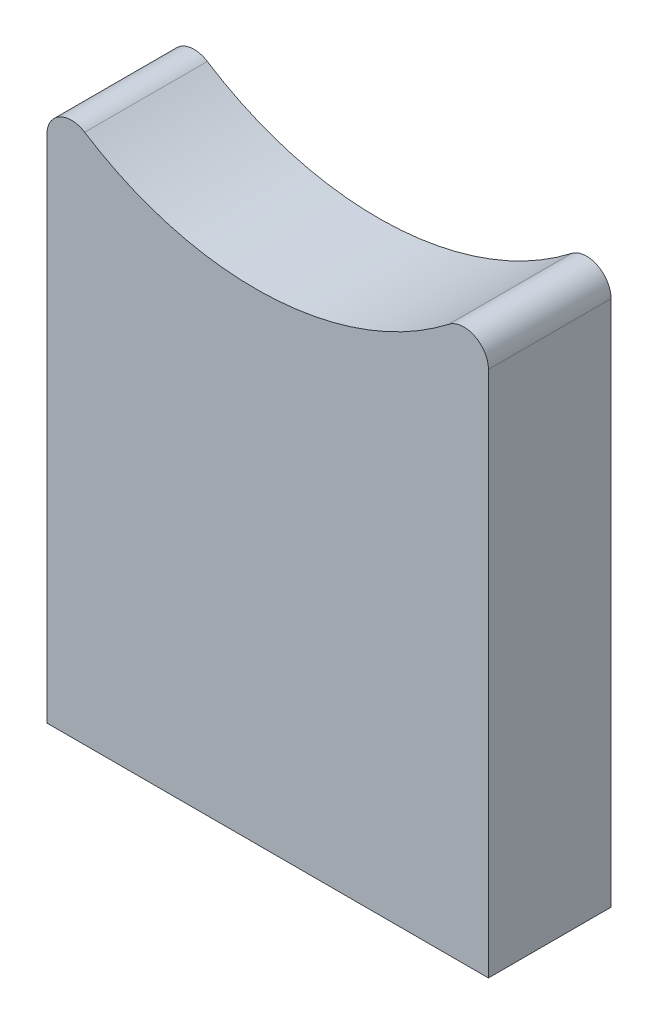
ISO-10303-21;
HEADER;
FILE_DESCRIPTION(('STEP AP214'),'2;1');
FILE_NAME('part.step','',(''),(''),'','','');
FILE_SCHEMA(('AUTOMOTIVE_DESIGN { 1 0 10303 214 1 1 1 1 }'));
ENDSEC;
DATA;
#1=APPLICATION_CONTEXT('core data for automotive mechanical design processes');
#2=APPLICATION_PROTOCOL_DEFINITION('international standard','automotive_design',2000,#1);
#3=PRODUCT_CONTEXT('',#1,'mechanical');
#4=PRODUCT('Part','Part','',(#3));
#5=PRODUCT_RELATED_PRODUCT_CATEGORY('part','',(#4));
#6=PRODUCT_DEFINITION_FORMATION('','',#4);
#7=PRODUCT_DEFINITION_CONTEXT('part definition',#1,'design');
#8=PRODUCT_DEFINITION('design','',#6,#7);
#9=PRODUCT_DEFINITION_SHAPE('','',#8);
#10=(LENGTH_UNIT() NAMED_UNIT(*) SI_UNIT(.MILLI.,.METRE.));
#11=(NAMED_UNIT(*) PLANE_ANGLE_UNIT() SI_UNIT($,.RADIAN.));
#12=(NAMED_UNIT(*) SI_UNIT($,.STERADIAN.) SOLID_ANGLE_UNIT());
#13=UNCERTAINTY_MEASURE_WITH_UNIT(LENGTH_MEASURE(1.E-05),#10,'distance_accuracy_value','');
#14=(GEOMETRIC_REPRESENTATION_CONTEXT(3) GLOBAL_UNCERTAINTY_ASSIGNED_CONTEXT((#13)) GLOBAL_UNIT_ASSIGNED_CONTEXT((#10,
#11,#12)) REPRESENTATION_CONTEXT('',''));
#15=CARTESIAN_POINT('',(0.,0.,0.));
#16=DIRECTION('',(0.,0.,1.));
#17=DIRECTION('',(1.,0.,0.));
#18=AXIS2_PLACEMENT_3D('',#15,#16,#17);
#19=CARTESIAN_POINT('',(18.,0.,10.));
#20=DIRECTION('',(0.,1.,0.));
#21=DIRECTION('',(-1.,0.,0.));
#22=AXIS2_PLACEMENT_3D('',#19,#20,#21);
#23=PLANE('',#22);
#24=DIRECTION('',(1.,0.,0.));
#25=VECTOR('',#24,1.);
#26=CARTESIAN_POINT('',(18.,0.,0.));
#27=LINE('',#26,#25);
#28=CARTESIAN_POINT('',(-18.,0.,0.));
#29=VERTEX_POINT('',#28);
#30=CARTESIAN_POINT('',(18.,0.,0.));
#31=VERTEX_POINT('',#30);
#32=EDGE_CURVE('E107',#29,#31,#27,.T.);
#33=ORIENTED_EDGE('',*,*,#32,.T.);
#34=DIRECTION('',(0.,0.,-1.));
#35=VECTOR('',#34,1.);
#36=CARTESIAN_POINT('',(18.,0.,10.));
#37=LINE('',#36,#35);
#38=CARTESIAN_POINT('',(18.,0.,10.));
#39=VERTEX_POINT('',#38);
#40=EDGE_CURVE('E92',#39,#31,#37,.T.);
#41=ORIENTED_EDGE('',*,*,#40,.F.);
#42=DIRECTION('',(1.,0.,0.));
#43=VECTOR('',#42,1.);
#44=CARTESIAN_POINT('',(18.,0.,10.));
#45=LINE('',#44,#43);
#46=CARTESIAN_POINT('',(-18.,0.,10.));
#47=VERTEX_POINT('',#46);
#48=EDGE_CURVE('E96',#47,#39,#45,.T.);
#49=ORIENTED_EDGE('',*,*,#48,.F.);
#50=DIRECTION('',(0.,0.,-1.));
#51=VECTOR('',#50,1.);
#52=CARTESIAN_POINT('',(-18.,0.,10.));
#53=LINE('',#52,#51);
#54=EDGE_CURVE('E109',#47,#29,#53,.T.);
#55=ORIENTED_EDGE('',*,*,#54,.T.);
#56=EDGE_LOOP('',(#33,#41,#49,#55));
#57=FACE_BOUND('',#56,.T.);
#58=ADVANCED_FACE('F35',(#57),#23,.F.);
#59=CARTESIAN_POINT('',(18.,47.5112575472764,10.));
#60=DIRECTION('',(-1.,0.,0.));
#61=DIRECTION('',(0.,-1.,0.));
#62=AXIS2_PLACEMENT_3D('',#59,#60,#61);
#63=PLANE('',#62);
#64=DIRECTION('',(0.,1.,0.));
#65=VECTOR('',#64,1.);
#66=CARTESIAN_POINT('',(18.,47.5112575472764,0.));
#67=LINE('',#66,#65);
#68=CARTESIAN_POINT('',(18.,42.9702226071036,0.));
#69=VERTEX_POINT('',#68);
#70=EDGE_CURVE('E135',#31,#69,#67,.T.);
#71=ORIENTED_EDGE('',*,*,#70,.T.);
#72=DIRECTION('',(0.,0.,-1.));
#73=VECTOR('',#72,1.);
#74=CARTESIAN_POINT('',(18.,42.9702226071036,10.));
#75=LINE('',#74,#73);
#76=CARTESIAN_POINT('',(18.,42.9702226071036,10.));
#77=VERTEX_POINT('',#76);
#78=EDGE_CURVE('E58',#69,#77,#75,.F.);
#79=ORIENTED_EDGE('',*,*,#78,.T.);
#80=DIRECTION('',(0.,1.,0.));
#81=VECTOR('',#80,1.);
#82=CARTESIAN_POINT('',(18.,47.5112575472764,10.));
#83=LINE('',#82,#81);
#84=EDGE_CURVE('E88',#39,#77,#83,.T.);
#85=ORIENTED_EDGE('',*,*,#84,.F.);
#86=ORIENTED_EDGE('',*,*,#40,.T.);
#87=EDGE_LOOP('',(#71,#79,#85,#86));
#88=FACE_BOUND('',#87,.T.);
#89=ADVANCED_FACE('F90',(#88),#63,.F.);
#90=CARTESIAN_POINT('',(-0.989813990238702,64.9636846664591,10.));
#91=DIRECTION('',(0.,0.,-1.));
#92=DIRECTION('',(-1.,0.,0.));
#93=AXIS2_PLACEMENT_3D('',#90,#91,#92);
#94=CYLINDRICAL_SURFACE('',#93,25.7914762612428);
#95=CARTESIAN_POINT('',(-0.989813990238702,64.9636846664591,10.));
#96=DIRECTION('',(0.,0.,-1.));
#97=DIRECTION('',(1.,0.,0.));
#98=AXIS2_PLACEMENT_3D('',#95,#96,#97);
#99=CIRCLE('',#98,25.7914762612428);
#100=CARTESIAN_POINT('',(14.7773363436665,44.5529713501077,10.));
#101=VERTEX_POINT('',#100);
#102=CARTESIAN_POINT('',(-14.919799303307,43.257562099037,10.));
#103=VERTEX_POINT('',#102);
#104=EDGE_CURVE('E95',#101,#103,#99,.T.);
#105=ORIENTED_EDGE('',*,*,#104,.F.);
#106=DIRECTION('',(0.,0.,-1.));
#107=VECTOR('',#106,1.);
#108=CARTESIAN_POINT('',(14.7773363436665,44.5529713501077,10.));
#109=LINE('',#108,#107);
#110=CARTESIAN_POINT('',(14.7773363436665,44.5529713501077,0.));
#111=VERTEX_POINT('',#110);
#112=EDGE_CURVE('E111',#101,#111,#109,.T.);
#113=ORIENTED_EDGE('',*,*,#112,.T.);
#114=CARTESIAN_POINT('',(-0.989813990238702,64.9636846664591,0.));
#115=DIRECTION('',(0.,0.,-1.));
#116=DIRECTION('',(1.,0.,0.));
#117=AXIS2_PLACEMENT_3D('',#114,#115,#116);
#118=CIRCLE('',#117,25.7914762612428);
#119=CARTESIAN_POINT('',(-14.919799303307,43.257562099037,0.));
#120=VERTEX_POINT('',#119);
#121=EDGE_CURVE('E136',#111,#120,#118,.T.);
#122=ORIENTED_EDGE('',*,*,#121,.T.);
#123=DIRECTION('',(0.,0.,-1.));
#124=VECTOR('',#123,1.);
#125=CARTESIAN_POINT('',(-14.919799303307,43.257562099037,10.));
#126=LINE('',#125,#124);
#127=EDGE_CURVE('E108',#120,#103,#126,.F.);
#128=ORIENTED_EDGE('',*,*,#127,.T.);
#129=EDGE_LOOP('',(#105,#113,#122,#128));
#130=FACE_BOUND('',#129,.T.);
#131=ADVANCED_FACE('F127',(#130),#94,.F.);
#132=CARTESIAN_POINT('',(-18.,0.,10.));
#133=DIRECTION('',(1.,0.,0.));
#134=DIRECTION('',(0.,0.,-1.));
#135=AXIS2_PLACEMENT_3D('',#132,#133,#134);
#136=PLANE('',#135);
#137=DIRECTION('',(0.,-1.,0.));
#138=VECTOR('',#137,1.);
#139=CARTESIAN_POINT('',(-18.,0.,10.));
#140=LINE('',#139,#138);
#141=CARTESIAN_POINT('',(-18.,41.5743608469985,10.));
#142=VERTEX_POINT('',#141);
#143=EDGE_CURVE('E100',#142,#47,#140,.T.);
#144=ORIENTED_EDGE('',*,*,#143,.F.);
#145=DIRECTION('',(0.,0.,-1.));
#146=VECTOR('',#145,1.);
#147=CARTESIAN_POINT('',(-18.,41.5743608469985,10.));
#148=LINE('',#147,#146);
#149=CARTESIAN_POINT('',(-18.,41.5743608469985,0.));
#150=VERTEX_POINT('',#149);
#151=EDGE_CURVE('E11',#142,#150,#148,.T.);
#152=ORIENTED_EDGE('',*,*,#151,.T.);
#153=DIRECTION('',(0.,-1.,0.));
#154=VECTOR('',#153,1.);
#155=CARTESIAN_POINT('',(-18.,0.,0.));
#156=LINE('',#155,#154);
#157=EDGE_CURVE('E104',#150,#29,#156,.T.);
#158=ORIENTED_EDGE('',*,*,#157,.T.);
#159=ORIENTED_EDGE('',*,*,#54,.F.);
#160=EDGE_LOOP('',(#144,#152,#158,#159));
#161=FACE_BOUND('',#160,.T.);
#162=ADVANCED_FACE('F143',(#161),#136,.F.);
#163=CARTESIAN_POINT('',(-0.989813990238702,64.9636846664591,10.));
#164=DIRECTION('',(0.,0.,1.));
#165=DIRECTION('',(1.,0.,0.));
#166=AXIS2_PLACEMENT_3D('',#163,#164,#165);
#167=PLANE('',#166);
#168=ORIENTED_EDGE('',*,*,#84,.T.);
#169=CARTESIAN_POINT('',(16.,42.9702226071036,10.));
#170=DIRECTION('',(0.,0.,1.));
#171=DIRECTION('',(1.,0.,0.));
#172=AXIS2_PLACEMENT_3D('',#169,#170,#171);
#173=CIRCLE('',#172,2.);
#174=EDGE_CURVE('E43',#77,#101,#173,.T.);
#175=ORIENTED_EDGE('',*,*,#174,.T.);
#176=ORIENTED_EDGE('',*,*,#104,.T.);
#177=CARTESIAN_POINT('',(-16.,41.5743608469985,10.));
#178=DIRECTION('',(0.,0.,1.));
#179=DIRECTION('',(1.,0.,0.));
#180=AXIS2_PLACEMENT_3D('',#177,#178,#179);
#181=CIRCLE('',#180,2.);
#182=EDGE_CURVE('E50',#103,#142,#181,.T.);
#183=ORIENTED_EDGE('',*,*,#182,.T.);
#184=ORIENTED_EDGE('',*,*,#143,.T.);
#185=ORIENTED_EDGE('',*,*,#48,.T.);
#186=EDGE_LOOP('',(#168,#175,#176,#183,#184,#185));
#187=FACE_BOUND('',#186,.T.);
#188=ADVANCED_FACE('F99',(#187),#167,.T.);
#189=CARTESIAN_POINT('',(-0.989813990238702,64.9636846664591,0.));
#190=DIRECTION('',(0.,0.,1.));
#191=DIRECTION('',(1.,0.,0.));
#192=AXIS2_PLACEMENT_3D('',#189,#190,#191);
#193=PLANE('',#192);
#194=ORIENTED_EDGE('',*,*,#121,.F.);
#195=CARTESIAN_POINT('',(16.,42.9702226071036,0.));
#196=DIRECTION('',(0.,0.,1.));
#197=DIRECTION('',(1.,0.,0.));
#198=AXIS2_PLACEMENT_3D('',#195,#196,#197);
#199=CIRCLE('',#198,2.);
#200=EDGE_CURVE('E120',#111,#69,#199,.F.);
#201=ORIENTED_EDGE('',*,*,#200,.T.);
#202=ORIENTED_EDGE('',*,*,#70,.F.);
#203=ORIENTED_EDGE('',*,*,#32,.F.);
#204=ORIENTED_EDGE('',*,*,#157,.F.);
#205=CARTESIAN_POINT('',(-16.,41.5743608469985,0.));
#206=DIRECTION('',(0.,0.,1.));
#207=DIRECTION('',(1.,0.,0.));
#208=AXIS2_PLACEMENT_3D('',#205,#206,#207);
#209=CIRCLE('',#208,2.);
#210=EDGE_CURVE('E118',#150,#120,#209,.F.);
#211=ORIENTED_EDGE('',*,*,#210,.T.);
#212=EDGE_LOOP('',(#194,#201,#202,#203,#204,#211));
#213=FACE_BOUND('',#212,.T.);
#214=ADVANCED_FACE('F134',(#213),#193,.F.);
#215=CARTESIAN_POINT('',(16.,42.9702226071036,10.));
#216=DIRECTION('',(0.,0.,-1.));
#217=DIRECTION('',(-1.,0.,0.));
#218=AXIS2_PLACEMENT_3D('',#215,#216,#217);
#219=CYLINDRICAL_SURFACE('',#218,2.);
#220=ORIENTED_EDGE('',*,*,#174,.F.);
#221=ORIENTED_EDGE('',*,*,#78,.F.);
#222=ORIENTED_EDGE('',*,*,#200,.F.);
#223=ORIENTED_EDGE('',*,*,#112,.F.);
#224=EDGE_LOOP('',(#220,#221,#222,#223));
#225=FACE_BOUND('',#224,.T.);
#226=ADVANCED_FACE('F132',(#225),#219,.T.);
#227=CARTESIAN_POINT('',(-16.,41.5743608469985,10.));
#228=DIRECTION('',(0.,0.,-1.));
#229=DIRECTION('',(-1.,0.,0.));
#230=AXIS2_PLACEMENT_3D('',#227,#228,#229);
#231=CYLINDRICAL_SURFACE('',#230,2.);
#232=ORIENTED_EDGE('',*,*,#182,.F.);
#233=ORIENTED_EDGE('',*,*,#127,.F.);
#234=ORIENTED_EDGE('',*,*,#210,.F.);
#235=ORIENTED_EDGE('',*,*,#151,.F.);
#236=EDGE_LOOP('',(#232,#233,#234,#235));
#237=FACE_BOUND('',#236,.T.);
#238=ADVANCED_FACE('F37',(#237),#231,.T.);
#239=CLOSED_SHELL('',(#58,#89,#131,#162,#188,#214,#226,#238));
#240=MANIFOLD_SOLID_BREP('B2',#239);
#241=ADVANCED_BREP_SHAPE_REPRESENTATION('',(#18,#240),#14);
#242=SHAPE_DEFINITION_REPRESENTATION(#9,#241);
ENDSEC;
END-ISO-10303-21;
